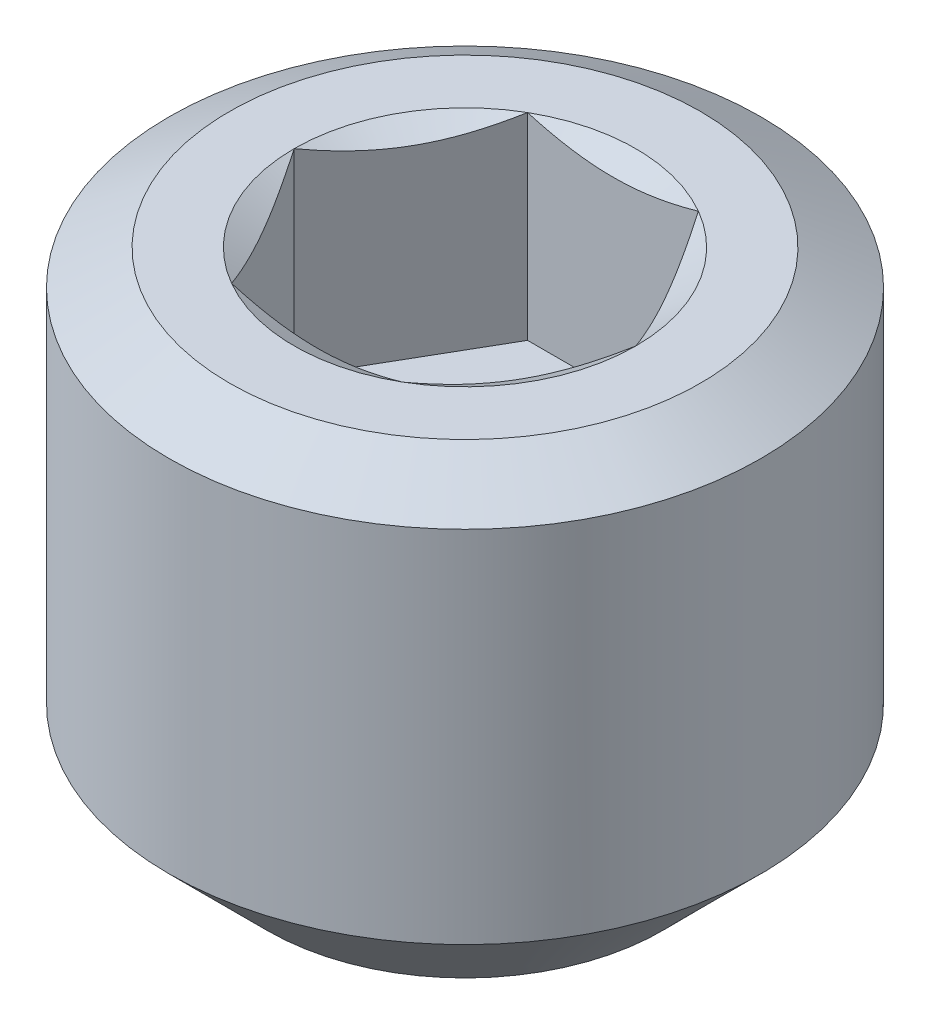
ISO-10303-21;
HEADER;
FILE_DESCRIPTION(('STEP AP214'),'2;1');
FILE_NAME('part.step','',(''),(''),'','','');
FILE_SCHEMA(('AUTOMOTIVE_DESIGN { 1 0 10303 214 1 1 1 1 }'));
ENDSEC;
DATA;
#1=APPLICATION_CONTEXT('core data for automotive mechanical design processes');
#2=APPLICATION_PROTOCOL_DEFINITION('international standard','automotive_design',2000,#1);
#3=PRODUCT_CONTEXT('',#1,'mechanical');
#4=PRODUCT('Part','Part','',(#3));
#5=PRODUCT_RELATED_PRODUCT_CATEGORY('part','',(#4));
#6=PRODUCT_DEFINITION_FORMATION('','',#4);
#7=PRODUCT_DEFINITION_CONTEXT('part definition',#1,'design');
#8=PRODUCT_DEFINITION('design','',#6,#7);
#9=PRODUCT_DEFINITION_SHAPE('','',#8);
#10=(LENGTH_UNIT() NAMED_UNIT(*) SI_UNIT(.MILLI.,.METRE.));
#11=(NAMED_UNIT(*) PLANE_ANGLE_UNIT() SI_UNIT($,.RADIAN.));
#12=(NAMED_UNIT(*) SI_UNIT($,.STERADIAN.) SOLID_ANGLE_UNIT());
#13=UNCERTAINTY_MEASURE_WITH_UNIT(LENGTH_MEASURE(1.E-05),#10,'distance_accuracy_value','');
#14=(GEOMETRIC_REPRESENTATION_CONTEXT(3) GLOBAL_UNCERTAINTY_ASSIGNED_CONTEXT((#13)) GLOBAL_UNIT_ASSIGNED_CONTEXT((#10,
#11,#12)) REPRESENTATION_CONTEXT('',''));
#15=CARTESIAN_POINT('',(0.,0.,0.));
#16=DIRECTION('',(0.,0.,1.));
#17=DIRECTION('',(1.,0.,0.));
#18=AXIS2_PLACEMENT_3D('',#15,#16,#17);
#19=CARTESIAN_POINT('',(-0.866025403784439,20.,19.7));
#20=DIRECTION('',(0.,0.,1.));
#21=DIRECTION('',(1.,0.,0.));
#22=AXIS2_PLACEMENT_3D('',#19,#20,#21);
#23=PLANE('',#22);
#24=DIRECTION('',(0.,1.,0.));
#25=VECTOR('',#24,1.);
#26=CARTESIAN_POINT('',(0.866025403784439,20.,19.7));
#27=LINE('',#26,#25);
#28=CARTESIAN_POINT('',(0.866025403787829,19.9999999999955,19.7000000000058));
#29=VERTEX_POINT('',#28);
#30=CARTESIAN_POINT('',(0.866025403784439,18.,19.7));
#31=VERTEX_POINT('',#30);
#32=EDGE_CURVE('E75',#29,#31,#27,.F.);
#33=ORIENTED_EDGE('',*,*,#32,.T.);
#34=DIRECTION('',(1.,0.,0.));
#35=VECTOR('',#34,1.);
#36=CARTESIAN_POINT('',(0.,18.,19.7));
#37=LINE('',#36,#35);
#38=CARTESIAN_POINT('',(-0.866025403784441,18.,19.7));
#39=VERTEX_POINT('',#38);
#40=EDGE_CURVE('E271',#31,#39,#37,.F.);
#41=ORIENTED_EDGE('',*,*,#40,.T.);
#42=DIRECTION('',(0.,1.,0.));
#43=VECTOR('',#42,1.);
#44=CARTESIAN_POINT('',(-0.866025403784441,20.,19.7));
#45=LINE('',#44,#43);
#46=CARTESIAN_POINT('',(-0.866025403784441,20.0000000000058,19.7));
#47=VERTEX_POINT('',#46);
#48=EDGE_CURVE('E78',#39,#47,#45,.T.);
#49=ORIENTED_EDGE('',*,*,#48,.T.);
#50=CARTESIAN_POINT('',(0.866025403788198,19.9999999999926,19.7));
#51=CARTESIAN_POINT('',(0.794933305630106,19.979475329645,19.7));
#52=CARTESIAN_POINT('',(0.723278805862876,19.9606844149257,19.7));
#53=CARTESIAN_POINT('',(0.578805828596787,19.9274738047229,19.7));
#54=CARTESIAN_POINT('',(0.50598512332056,19.9130638895754,19.7));
#55=CARTESIAN_POINT('',(0.361160826229718,19.8898910014936,19.7));
#56=CARTESIAN_POINT('',(0.289177624520724,19.8810044804205,19.7));
#57=CARTESIAN_POINT('',(0.144795924120527,19.8690748529648,19.7));
#58=CARTESIAN_POINT('',(0.0723979620602636,19.8660254037625,19.7));
#59=CARTESIAN_POINT('',(-0.0723979620604706,19.8660254037625,19.7));
#60=CARTESIAN_POINT('',(-0.144795924120941,19.8690748529648,19.7));
#61=CARTESIAN_POINT('',(-0.289177624521547,19.8810044804206,19.7));
#62=CARTESIAN_POINT('',(-0.361160826230745,19.8898910014938,19.7));
#63=CARTESIAN_POINT('',(-0.505985123321997,19.9130638895757,19.7));
#64=CARTESIAN_POINT('',(-0.57880582859843,19.9274738047232,19.7));
#65=CARTESIAN_POINT('',(-0.723278805864925,19.9606844149262,19.7));
#66=CARTESIAN_POINT('',(-0.794933305632354,19.9794753296456,19.7));
#67=CARTESIAN_POINT('',(-0.866025403790643,19.9999999999933,19.7));
#68=B_SPLINE_CURVE_WITH_KNOTS('',3,(#50,#51,#52,#53,#54,#55,#56,#57,#58,#59,#60,#61,#62,#63,#64,
#65,#66,#67),.UNSPECIFIED.,.F.,.F.,(4,2,2,2,2,2,2,2,4),(0.,0.222055046940025,0.444602239570264,
0.661973144382565,0.879107709999785,1.09624227561762,1.31361318043055,1.53616037306144,
1.75821542000211),.UNSPECIFIED.);
#69=EDGE_CURVE('E21',#29,#47,#68,.T.);
#70=ORIENTED_EDGE('',*,*,#69,.F.);
#71=EDGE_LOOP('',(#33,#41,#49,#70));
#72=FACE_BOUND('',#71,.T.);
#73=ADVANCED_FACE('F17',(#72),#23,.F.);
#74=CARTESIAN_POINT('',(0.866025403784439,20.,16.7));
#75=DIRECTION('',(0.,0.,-1.));
#76=DIRECTION('',(-1.,0.,0.));
#77=AXIS2_PLACEMENT_3D('',#74,#75,#76);
#78=PLANE('',#77);
#79=DIRECTION('',(0.,1.,0.));
#80=VECTOR('',#79,1.);
#81=CARTESIAN_POINT('',(-0.866025403784439,20.,16.7));
#82=LINE('',#81,#80);
#83=CARTESIAN_POINT('',(-0.866025403779539,19.999999999996,16.6999999999882));
#84=VERTEX_POINT('',#83);
#85=CARTESIAN_POINT('',(-0.866025403784439,18.,16.7));
#86=VERTEX_POINT('',#85);
#87=EDGE_CURVE('E235',#84,#86,#82,.F.);
#88=ORIENTED_EDGE('',*,*,#87,.T.);
#89=DIRECTION('',(1.,0.,0.));
#90=VECTOR('',#89,1.);
#91=CARTESIAN_POINT('',(0.,18.,16.7));
#92=LINE('',#91,#90);
#93=CARTESIAN_POINT('',(0.86602540378444,18.,16.7));
#94=VERTEX_POINT('',#93);
#95=EDGE_CURVE('E171',#86,#94,#92,.T.);
#96=ORIENTED_EDGE('',*,*,#95,.T.);
#97=DIRECTION('',(0.,1.,0.));
#98=VECTOR('',#97,1.);
#99=CARTESIAN_POINT('',(0.866025403784441,20.,16.7));
#100=LINE('',#99,#98);
#101=CARTESIAN_POINT('',(0.866025403787829,19.9999999999605,16.6999999999942));
#102=VERTEX_POINT('',#101);
#103=EDGE_CURVE('E90',#94,#102,#100,.T.);
#104=ORIENTED_EDGE('',*,*,#103,.T.);
#105=CARTESIAN_POINT('',(-0.866025403788196,19.9999999999926,16.7));
#106=CARTESIAN_POINT('',(-0.794933305630107,19.979475329645,16.7));
#107=CARTESIAN_POINT('',(-0.72327880586288,19.9606844149257,16.7));
#108=CARTESIAN_POINT('',(-0.578805828596799,19.9274738047229,16.7));
#109=CARTESIAN_POINT('',(-0.505985123320576,19.9130638895754,16.7));
#110=CARTESIAN_POINT('',(-0.361160826229735,19.8898910014937,16.7));
#111=CARTESIAN_POINT('',(-0.289177624520738,19.8810044804206,16.7));
#112=CARTESIAN_POINT('',(-0.144795924120535,19.8690748529648,16.7));
#113=CARTESIAN_POINT('',(-0.0723979620602673,19.8660254037625,16.7));
#114=CARTESIAN_POINT('',(0.0723979620594876,19.8660254037625,16.7));
#115=CARTESIAN_POINT('',(0.144795924118975,19.8690748529647,16.7));
#116=CARTESIAN_POINT('',(0.289177624517631,19.8810044804202,16.7));
#117=CARTESIAN_POINT('',(0.361160826225861,19.8898910014932,16.7));
#118=CARTESIAN_POINT('',(0.505985123315155,19.9130638895745,16.7));
#119=CARTESIAN_POINT('',(0.578805828590598,19.9274738047216,16.7));
#120=CARTESIAN_POINT('',(0.723278805855152,19.9606844149237,16.7));
#121=CARTESIAN_POINT('',(0.79493330562163,19.9794753296427,16.7));
#122=CARTESIAN_POINT('',(0.866025403778981,19.99999999999,16.7));
#123=B_SPLINE_CURVE_WITH_KNOTS('',3,(#105,#106,#107,#108,#109,#110,#111,#112,#113,#114,#115,
#116,#117,#118,#119,#120,#121,#122),.UNSPECIFIED.,.F.,.F.,(4,2,2,2,2,2,2,2,4),(0.,
0.222055046940014,0.444602239570241,0.661973144382551,0.879107709999782,1.09624227561468,
1.31361318042464,1.53616037305241,1.75821541998998),.UNSPECIFIED.);
#124=EDGE_CURVE('E79',#84,#102,#123,.T.);
#125=ORIENTED_EDGE('',*,*,#124,.F.);
#126=EDGE_LOOP('',(#88,#96,#104,#125));
#127=FACE_BOUND('',#126,.T.);
#128=ADVANCED_FACE('F163',(#127),#78,.F.);
#129=CARTESIAN_POINT('',(0.,18.,18.2));
#130=DIRECTION('',(0.,-1.,0.));
#131=DIRECTION('',(0.,0.,-1.));
#132=AXIS2_PLACEMENT_3D('',#129,#130,#131);
#133=PLANE('',#132);
#134=ORIENTED_EDGE('',*,*,#40,.F.);
#135=DIRECTION('',(0.5,0.,-0.866025403784439));
#136=VECTOR('',#135,1.);
#137=CARTESIAN_POINT('',(0.866025403784439,18.,19.7));
#138=LINE('',#137,#136);
#139=CARTESIAN_POINT('',(1.73205080756888,18.,18.2));
#140=VERTEX_POINT('',#139);
#141=EDGE_CURVE('E89',#31,#140,#138,.T.);
#142=ORIENTED_EDGE('',*,*,#141,.T.);
#143=DIRECTION('',(-0.5,0.,-0.866025403784439));
#144=VECTOR('',#143,1.);
#145=CARTESIAN_POINT('',(1.73205080756888,18.,18.2));
#146=LINE('',#145,#144);
#147=EDGE_CURVE('E261',#140,#94,#146,.T.);
#148=ORIENTED_EDGE('',*,*,#147,.T.);
#149=ORIENTED_EDGE('',*,*,#95,.F.);
#150=DIRECTION('',(-0.5,0.,0.866025403784439));
#151=VECTOR('',#150,1.);
#152=CARTESIAN_POINT('',(-0.866025403784439,18.,16.7));
#153=LINE('',#152,#151);
#154=CARTESIAN_POINT('',(-1.73205080756888,18.,18.2));
#155=VERTEX_POINT('',#154);
#156=EDGE_CURVE('E237',#86,#155,#153,.T.);
#157=ORIENTED_EDGE('',*,*,#156,.T.);
#158=DIRECTION('',(0.5,0.,0.866025403784439));
#159=VECTOR('',#158,1.);
#160=CARTESIAN_POINT('',(-1.73205080756888,18.,18.2));
#161=LINE('',#160,#159);
#162=EDGE_CURVE('E243',#155,#39,#161,.T.);
#163=ORIENTED_EDGE('',*,*,#162,.T.);
#164=EDGE_LOOP('',(#134,#142,#148,#149,#157,#163));
#165=FACE_BOUND('',#164,.T.);
#166=ADVANCED_FACE('F160',(#165),#133,.F.);
#167=CARTESIAN_POINT('',(1.73205080756888,20.,18.2));
#168=DIRECTION('',(0.866025403784439,0.,-0.5));
#169=DIRECTION('',(-0.5,0.,-0.866025403784439));
#170=AXIS2_PLACEMENT_3D('',#167,#168,#169);
#171=PLANE('',#170);
#172=ORIENTED_EDGE('',*,*,#103,.F.);
#173=ORIENTED_EDGE('',*,*,#147,.F.);
#174=DIRECTION('',(0.,1.,0.));
#175=VECTOR('',#174,1.);
#176=CARTESIAN_POINT('',(1.73205080756888,20.,18.2));
#177=LINE('',#176,#175);
#178=CARTESIAN_POINT('',(1.73205080757566,19.9999999999955,18.2));
#179=VERTEX_POINT('',#178);
#180=EDGE_CURVE('E253',#140,#179,#177,.T.);
#181=ORIENTED_EDGE('',*,*,#180,.T.);
#182=CARTESIAN_POINT('',(1.73205080757083,19.9999999999927,18.2000000000034));
#183=CARTESIAN_POINT('',(1.69399423591343,19.9780216588368,18.1340840843309));
#184=CARTESIAN_POINT('',(1.65560916047086,19.9580335078162,18.067599183412));
#185=CARTESIAN_POINT('',(1.57817439768088,19.9231447905399,17.9334782399877));
#186=CARTESIAN_POINT('',(1.53912333491547,19.9082565652427,17.8658398151884));
#187=CARTESIAN_POINT('',(1.46150514962965,19.8850819691978,17.7314011746821));
#188=CARTESIAN_POINT('',(1.42294996631652,19.8766413406855,17.6646216382886));
#189=CARTESIAN_POINT('',(1.34565827946197,19.8665668760853,17.5307485096538));
#190=CARTESIAN_POINT('',(1.30692205666204,19.8649246954681,17.4636554036711));
#191=CARTESIAN_POINT('',(1.23454757988258,19.8683497176036,17.3382991327178));
#192=CARTESIAN_POINT('',(1.20089846552319,19.8725759638998,17.2800171570177));
#193=CARTESIAN_POINT('',(1.13381944980834,19.8859679755265,17.1638328936778));
#194=CARTESIAN_POINT('',(1.10038978028812,19.8951383110645,17.1059310075886));
#195=CARTESIAN_POINT('',(1.03317257547485,19.9180623749922,16.9895073937092));
#196=CARTESIAN_POINT('',(0.999393543134575,19.9319132316524,16.9310003934654));
#197=CARTESIAN_POINT('',(0.93233914700621,19.9633488206188,16.8148587725002));
#198=CARTESIAN_POINT('',(0.899062924836467,19.9809261715538,16.7572226650182));
#199=CARTESIAN_POINT('',(0.86602540378717,19.99999999999,16.7000000000047));
#200=B_SPLINE_CURVE_WITH_KNOTS('',3,(#182,#183,#184,#185,#186,#187,#188,#189,#190,#191,#192,
#193,#194,#195,#196,#197,#198,#199),.UNSPECIFIED.,.F.,.F.,(4,2,2,2,2,2,2,2,4),(0.,
0.237762008669122,0.476095362773337,0.708530704618816,0.940680666678586,1.14278083697773,
1.3450681453482,1.55184121686769,1.7582084801362),.UNSPECIFIED.);
#201=EDGE_CURVE('E97',#179,#102,#200,.T.);
#202=ORIENTED_EDGE('',*,*,#201,.T.);
#203=EDGE_LOOP('',(#172,#173,#181,#202));
#204=FACE_BOUND('',#203,.T.);
#205=ADVANCED_FACE('F155',(#204),#171,.F.);
#206=CARTESIAN_POINT('',(0.866025403784439,20.,19.7));
#207=DIRECTION('',(0.866025403784439,0.,0.5));
#208=DIRECTION('',(0.5,0.,-0.866025403784439));
#209=AXIS2_PLACEMENT_3D('',#206,#207,#208);
#210=PLANE('',#209);
#211=ORIENTED_EDGE('',*,*,#180,.F.);
#212=ORIENTED_EDGE('',*,*,#141,.F.);
#213=ORIENTED_EDGE('',*,*,#32,.F.);
#214=CARTESIAN_POINT('',(0.86602540378256,19.9999999999926,19.7000000000033));
#215=CARTESIAN_POINT('',(0.904081975439967,19.9780216588368,19.6340840843307));
#216=CARTESIAN_POINT('',(0.942467050882538,19.9580335078162,19.5675991834118));
#217=CARTESIAN_POINT('',(1.01990181367252,19.9231447905399,19.4334782399876));
#218=CARTESIAN_POINT('',(1.05895287643793,19.9082565652426,19.3658398151883));
#219=CARTESIAN_POINT('',(1.13657106172375,19.8850819691977,19.231401174682));
#220=CARTESIAN_POINT('',(1.17512624503687,19.8766413406855,19.1646216382885));
#221=CARTESIAN_POINT('',(1.25241793189141,19.8665668760853,19.0307485096537));
#222=CARTESIAN_POINT('',(1.29115415469134,19.8649246954681,18.9636554036709));
#223=CARTESIAN_POINT('',(1.36352863147119,19.8683497176037,18.838299132717));
#224=CARTESIAN_POINT('',(1.39717774583097,19.8725759638999,18.7800171570162));
#225=CARTESIAN_POINT('',(1.4642567615466,19.8859679755268,18.663832893675));
#226=CARTESIAN_POINT('',(1.49768643106721,19.8951383110651,18.6059310075851));
#227=CARTESIAN_POINT('',(1.56490363588126,19.9180623749933,18.4895073937044));
#228=CARTESIAN_POINT('',(1.59868266822192,19.9319132316538,18.4310003934599));
#229=CARTESIAN_POINT('',(1.66573706435105,19.9633488206208,18.3148587724933));
#230=CARTESIAN_POINT('',(1.69901328652117,19.9809261715561,18.2572226650107));
#231=CARTESIAN_POINT('',(1.73205080757083,19.9999999999927,18.1999999999966));
#232=B_SPLINE_CURVE_WITH_KNOTS('',3,(#214,#215,#216,#217,#218,#219,#220,#221,#222,#223,#224,
#225,#226,#227,#228,#229,#230,#231),.UNSPECIFIED.,.F.,.F.,(4,2,2,2,2,2,2,2,4),(0.,
0.237762008669113,0.476095362773325,0.708530704618782,0.940680666678525,1.14278083698003,
1.34506814535286,1.55184121687484,1.7582084801458),.UNSPECIFIED.);
#233=EDGE_CURVE('E86',#29,#179,#232,.T.);
#234=ORIENTED_EDGE('',*,*,#233,.T.);
#235=EDGE_LOOP('',(#211,#212,#213,#234));
#236=FACE_BOUND('',#235,.T.);
#237=ADVANCED_FACE('F85',(#236),#210,.F.);
#238=CARTESIAN_POINT('',(-1.73205080756888,20.,18.2));
#239=DIRECTION('',(-0.866025403784439,0.,0.5));
#240=DIRECTION('',(0.5,0.,0.866025403784439));
#241=AXIS2_PLACEMENT_3D('',#238,#239,#240);
#242=PLANE('',#241);
#243=ORIENTED_EDGE('',*,*,#48,.F.);
#244=ORIENTED_EDGE('',*,*,#162,.F.);
#245=DIRECTION('',(0.,1.,0.));
#246=VECTOR('',#245,1.);
#247=CARTESIAN_POINT('',(-1.73205080756888,20.,18.2));
#248=LINE('',#247,#246);
#249=CARTESIAN_POINT('',(-1.73205080757566,19.9999999999955,18.2));
#250=VERTEX_POINT('',#249);
#251=EDGE_CURVE('E40',#155,#250,#248,.T.);
#252=ORIENTED_EDGE('',*,*,#251,.T.);
#253=CARTESIAN_POINT('',(-1.73205080757084,19.9999999999927,18.1999999999966));
#254=CARTESIAN_POINT('',(-1.69399423591343,19.9780216588368,18.2659159156691));
#255=CARTESIAN_POINT('',(-1.65560916047086,19.9580335078162,18.332400816588));
#256=CARTESIAN_POINT('',(-1.57817439768088,19.9231447905399,18.4665217600123));
#257=CARTESIAN_POINT('',(-1.53912333491546,19.9082565652427,18.5341601848116));
#258=CARTESIAN_POINT('',(-1.46150514962964,19.8850819691977,18.6685988253179));
#259=CARTESIAN_POINT('',(-1.42294996631652,19.8766413406855,18.7353783617114));
#260=CARTESIAN_POINT('',(-1.34565827946197,19.8665668760853,18.8692514903462));
#261=CARTESIAN_POINT('',(-1.30692205666205,19.8649246954681,18.936344596329));
#262=CARTESIAN_POINT('',(-1.23454757988209,19.8683497176037,19.061700867283));
#263=CARTESIAN_POINT('',(-1.20089846552221,19.8725759638999,19.119982842984));
#264=CARTESIAN_POINT('',(-1.13381944980638,19.8859679755269,19.2361671063256));
#265=CARTESIAN_POINT('',(-1.10038978028568,19.8951383110652,19.2940689924157));
#266=CARTESIAN_POINT('',(-1.03317257547143,19.9180623749935,19.4104926062967));
#267=CARTESIAN_POINT('',(-0.999393543130664,19.9319132316541,19.4689996065414));
#268=CARTESIAN_POINT('',(-0.932339147001328,19.9633488206213,19.5851412275083));
#269=CARTESIAN_POINT('',(-0.899062924831109,19.9809261715567,19.642777334991));
#270=CARTESIAN_POINT('',(-0.866025403781341,19.9999999999933,19.7000000000053));
#271=B_SPLINE_CURVE_WITH_KNOTS('',3,(#253,#254,#255,#256,#257,#258,#259,#260,#261,#262,#263,
#264,#265,#266,#267,#268,#269,#270),.UNSPECIFIED.,.F.,.F.,(4,2,2,2,2,2,2,2,4),(0.,
0.237762008669133,0.476095362773361,0.708530704618827,0.940680666678586,1.14278083698067,
1.34506814535411,1.55184121687673,1.75820848014832),.UNSPECIFIED.);
#272=EDGE_CURVE('E96',#250,#47,#271,.T.);
#273=ORIENTED_EDGE('',*,*,#272,.T.);
#274=EDGE_LOOP('',(#243,#244,#252,#273));
#275=FACE_BOUND('',#274,.T.);
#276=ADVANCED_FACE('F154',(#275),#242,.F.);
#277=CARTESIAN_POINT('',(-0.866025403784439,20.,16.7));
#278=DIRECTION('',(-0.866025403784439,0.,-0.5));
#279=DIRECTION('',(-0.5,0.,0.866025403784439));
#280=AXIS2_PLACEMENT_3D('',#277,#278,#279);
#281=PLANE('',#280);
#282=ORIENTED_EDGE('',*,*,#251,.F.);
#283=ORIENTED_EDGE('',*,*,#156,.F.);
#284=ORIENTED_EDGE('',*,*,#87,.F.);
#285=CARTESIAN_POINT('',(-0.866025403782559,19.9999999999926,16.6999999999967));
#286=CARTESIAN_POINT('',(-0.904081975439967,19.9780216588368,16.7659159156693));
#287=CARTESIAN_POINT('',(-0.942467050882539,19.9580335078162,16.8324008165882));
#288=CARTESIAN_POINT('',(-1.01990181367252,19.9231447905399,16.9665217600124));
#289=CARTESIAN_POINT('',(-1.05895287643793,19.9082565652427,17.0341601848117));
#290=CARTESIAN_POINT('',(-1.13657106172375,19.8850819691977,17.168598825318));
#291=CARTESIAN_POINT('',(-1.17512624503687,19.8766413406855,17.2353783617115));
#292=CARTESIAN_POINT('',(-1.25241793189141,19.8665668760853,17.3692514903463));
#293=CARTESIAN_POINT('',(-1.29115415469134,19.8649246954681,17.4363445963291));
#294=CARTESIAN_POINT('',(-1.36352863147119,19.8683497176037,17.561700867283));
#295=CARTESIAN_POINT('',(-1.39717774583097,19.8725759638999,17.6199828429838));
#296=CARTESIAN_POINT('',(-1.4642567615466,19.8859679755268,17.736167106325));
#297=CARTESIAN_POINT('',(-1.49768643106721,19.8951383110651,17.7940689924149));
#298=CARTESIAN_POINT('',(-1.56490363588126,19.9180623749933,17.9104926062956));
#299=CARTESIAN_POINT('',(-1.59868266822192,19.9319132316538,17.9689996065401));
#300=CARTESIAN_POINT('',(-1.66573706435105,19.9633488206208,18.0851412275067));
#301=CARTESIAN_POINT('',(-1.69901328652117,19.9809261715561,18.1427773349893));
#302=CARTESIAN_POINT('',(-1.73205080757083,19.9999999999927,18.2000000000034));
#303=B_SPLINE_CURVE_WITH_KNOTS('',3,(#285,#286,#287,#288,#289,#290,#291,#292,#293,#294,#295,
#296,#297,#298,#299,#300,#301,#302),.UNSPECIFIED.,.F.,.F.,(4,2,2,2,2,2,2,2,4),(0.,
0.237762008669116,0.476095362773325,0.708530704618782,0.940680666678525,1.14278083698002,
1.34506814535286,1.55184121687484,1.7582084801458),.UNSPECIFIED.);
#304=EDGE_CURVE('E110',#84,#250,#303,.T.);
#305=ORIENTED_EDGE('',*,*,#304,.T.);
#306=EDGE_LOOP('',(#282,#283,#284,#305));
#307=FACE_BOUND('',#306,.T.);
#308=ADVANCED_FACE('F122',(#307),#281,.F.);
#309=CARTESIAN_POINT('',(0.,19.9999999998681,18.2));
#310=DIRECTION('',(0.,1.,0.));
#311=DIRECTION('',(0.,0.,1.));
#312=AXIS2_PLACEMENT_3D('',#309,#310,#311);
#313=CONICAL_SURFACE('',#312,1.73205080735506,1.04719755115306);
#314=ORIENTED_EDGE('',*,*,#124,.T.);
#315=CARTESIAN_POINT('',(0.,19.9999999999215,18.2));
#316=DIRECTION('',(0.,1.,0.));
#317=DIRECTION('',(0.,0.,1.));
#318=AXIS2_PLACEMENT_3D('',#315,#316,#317);
#319=CIRCLE('',#318,1.73205080744765);
#320=EDGE_CURVE('E105',#84,#102,#319,.F.);
#321=ORIENTED_EDGE('',*,*,#320,.F.);
#322=EDGE_LOOP('',(#314,#321));
#323=FACE_BOUND('',#322,.T.);
#324=ADVANCED_FACE('F172',(#323),#313,.F.);
#325=CARTESIAN_POINT('',(0.,19.9999999998681,18.2));
#326=DIRECTION('',(0.,1.,0.));
#327=DIRECTION('',(0.,0.,1.));
#328=AXIS2_PLACEMENT_3D('',#325,#326,#327);
#329=CONICAL_SURFACE('',#328,1.73205080735506,1.04719755118333);
#330=CARTESIAN_POINT('',(0.,19.9999999999994,18.2));
#331=DIRECTION('',(0.,1.,0.));
#332=DIRECTION('',(0.,0.,1.));
#333=AXIS2_PLACEMENT_3D('',#330,#331,#332);
#334=CIRCLE('',#333,1.73205080758244);
#335=EDGE_CURVE('E103',#102,#179,#334,.F.);
#336=ORIENTED_EDGE('',*,*,#335,.F.);
#337=ORIENTED_EDGE('',*,*,#201,.F.);
#338=EDGE_LOOP('',(#336,#337));
#339=FACE_BOUND('',#338,.T.);
#340=ADVANCED_FACE('F141',(#339),#329,.F.);
#341=CARTESIAN_POINT('',(0.,19.9999999998681,18.2));
#342=DIRECTION('',(0.,1.,0.));
#343=DIRECTION('',(0.,0.,1.));
#344=AXIS2_PLACEMENT_3D('',#341,#342,#343);
#345=CONICAL_SURFACE('',#344,1.73205080735506,1.04719755118333);
#346=CARTESIAN_POINT('',(0.,19.9999999999994,18.2));
#347=DIRECTION('',(0.,1.,0.));
#348=DIRECTION('',(0.,0.,1.));
#349=AXIS2_PLACEMENT_3D('',#346,#347,#348);
#350=CIRCLE('',#349,1.73205080758244);
#351=EDGE_CURVE('E68',#179,#29,#350,.F.);
#352=ORIENTED_EDGE('',*,*,#351,.F.);
#353=ORIENTED_EDGE('',*,*,#233,.F.);
#354=EDGE_LOOP('',(#352,#353));
#355=FACE_BOUND('',#354,.T.);
#356=ADVANCED_FACE('F94',(#355),#345,.F.);
#357=CARTESIAN_POINT('',(0.,19.9999999998681,18.2));
#358=DIRECTION('',(0.,1.,0.));
#359=DIRECTION('',(0.,0.,1.));
#360=AXIS2_PLACEMENT_3D('',#357,#358,#359);
#361=CONICAL_SURFACE('',#360,1.73205080735506,1.04719755115306);
#362=ORIENTED_EDGE('',*,*,#69,.T.);
#363=CARTESIAN_POINT('',(0.,20.0000000000201,18.2));
#364=DIRECTION('',(0.,1.,0.));
#365=DIRECTION('',(0.,0.,1.));
#366=AXIS2_PLACEMENT_3D('',#363,#364,#365);
#367=CIRCLE('',#366,1.73205080761818);
#368=EDGE_CURVE('E60',#29,#47,#367,.F.);
#369=ORIENTED_EDGE('',*,*,#368,.F.);
#370=EDGE_LOOP('',(#362,#369));
#371=FACE_BOUND('',#370,.T.);
#372=ADVANCED_FACE('F62',(#371),#361,.F.);
#373=CARTESIAN_POINT('',(0.,19.9999999998681,18.2));
#374=DIRECTION('',(0.,1.,0.));
#375=DIRECTION('',(0.,0.,1.));
#376=AXIS2_PLACEMENT_3D('',#373,#374,#375);
#377=CONICAL_SURFACE('',#376,1.73205080735506,1.04719755118333);
#378=CARTESIAN_POINT('',(0.,19.9999999999994,18.2));
#379=DIRECTION('',(0.,1.,0.));
#380=DIRECTION('',(0.,0.,1.));
#381=AXIS2_PLACEMENT_3D('',#378,#379,#380);
#382=CIRCLE('',#381,1.73205080758244);
#383=EDGE_CURVE('E67',#47,#250,#382,.F.);
#384=ORIENTED_EDGE('',*,*,#383,.F.);
#385=ORIENTED_EDGE('',*,*,#272,.F.);
#386=EDGE_LOOP('',(#384,#385));
#387=FACE_BOUND('',#386,.T.);
#388=ADVANCED_FACE('F129',(#387),#377,.F.);
#389=CARTESIAN_POINT('',(0.,19.9999999998681,18.2));
#390=DIRECTION('',(0.,1.,0.));
#391=DIRECTION('',(0.,0.,1.));
#392=AXIS2_PLACEMENT_3D('',#389,#390,#391);
#393=CONICAL_SURFACE('',#392,1.73205080735506,1.04719755118333);
#394=CARTESIAN_POINT('',(0.,19.9999999999994,18.2));
#395=DIRECTION('',(0.,1.,0.));
#396=DIRECTION('',(0.,0.,1.));
#397=AXIS2_PLACEMENT_3D('',#394,#395,#396);
#398=CIRCLE('',#397,1.73205080758244);
#399=EDGE_CURVE('E221',#250,#84,#398,.F.);
#400=ORIENTED_EDGE('',*,*,#399,.F.);
#401=ORIENTED_EDGE('',*,*,#304,.F.);
#402=EDGE_LOOP('',(#400,#401));
#403=FACE_BOUND('',#402,.T.);
#404=ADVANCED_FACE('F125',(#403),#393,.F.);
#405=CARTESIAN_POINT('',(0.,20.,16.1407245962156));
#406=DIRECTION('',(0.,1.,0.));
#407=DIRECTION('',(0.,0.,1.));
#408=AXIS2_PLACEMENT_3D('',#405,#406,#407);
#409=PLANE('',#408);
#410=ORIENTED_EDGE('',*,*,#383,.T.);
#411=ORIENTED_EDGE('',*,*,#399,.T.);
#412=ORIENTED_EDGE('',*,*,#320,.T.);
#413=ORIENTED_EDGE('',*,*,#335,.T.);
#414=ORIENTED_EDGE('',*,*,#351,.T.);
#415=ORIENTED_EDGE('',*,*,#368,.T.);
#416=EDGE_LOOP('',(#410,#411,#412,#413,#414,#415));
#417=FACE_BOUND('',#416,.T.);
#418=CARTESIAN_POINT('',(0.,20.0000000000573,18.2));
#419=DIRECTION('',(0.,-1.,0.));
#420=DIRECTION('',(0.,0.,-1.));
#421=AXIS2_PLACEMENT_3D('',#418,#419,#420);
#422=CIRCLE('',#421,2.38649999994323);
#423=CARTESIAN_POINT('',(0.,20.0000000000573,15.8135000000568));
#424=VERTEX_POINT('',#423);
#425=EDGE_CURVE('E212',#424,#424,#422,.T.);
#426=ORIENTED_EDGE('',*,*,#425,.F.);
#427=EDGE_LOOP('',(#426));
#428=FACE_BOUND('',#427,.T.);
#429=ADVANCED_FACE('F99',(#417,#428),#409,.T.);
#430=CARTESIAN_POINT('',(0.,15.,17.2));
#431=DIRECTION('',(0.,-1.,0.));
#432=DIRECTION('',(0.,0.,-1.));
#433=AXIS2_PLACEMENT_3D('',#430,#431,#432);
#434=PLANE('',#433);
#435=CARTESIAN_POINT('',(0.,15.0000000001358,18.2));
#436=DIRECTION('',(0.,1.,0.));
#437=DIRECTION('',(0.,0.,1.));
#438=AXIS2_PLACEMENT_3D('',#435,#436,#437);
#439=CIRCLE('',#438,2.00000000018008);
#440=CARTESIAN_POINT('',(0.,15.0000000001358,20.2000000001801));
#441=VERTEX_POINT('',#440);
#442=EDGE_CURVE('E210',#441,#441,#439,.T.);
#443=ORIENTED_EDGE('',*,*,#442,.F.);
#444=EDGE_LOOP('',(#443));
#445=FACE_BOUND('',#444,.T.);
#446=ADVANCED_FACE('F200',(#445),#434,.T.);
#447=CARTESIAN_POINT('',(0.,19.6457956100175,18.2));
#448=DIRECTION('',(0.,-1.,0.));
#449=DIRECTION('',(0.,0.,-1.));
#450=AXIS2_PLACEMENT_3D('',#447,#448,#449);
#451=CONICAL_SURFACE('',#450,2.99999999972279,1.04719755117319);
#452=ORIENTED_EDGE('',*,*,#425,.T.);
#453=EDGE_LOOP('',(#452));
#454=FACE_BOUND('',#453,.T.);
#455=CARTESIAN_POINT('',(0.,19.6457956098522,18.2));
#456=DIRECTION('',(0.,1.,0.));
#457=DIRECTION('',(0.,0.,1.));
#458=AXIS2_PLACEMENT_3D('',#455,#456,#457);
#459=CIRCLE('',#458,3.);
#460=CARTESIAN_POINT('',(0.,19.6457956098522,21.2));
#461=VERTEX_POINT('',#460);
#462=EDGE_CURVE('E32',#461,#461,#459,.F.);
#463=ORIENTED_EDGE('',*,*,#462,.F.);
#464=EDGE_LOOP('',(#463));
#465=FACE_BOUND('',#464,.T.);
#466=ADVANCED_FACE('F193',(#454,#465),#451,.T.);
#467=CARTESIAN_POINT('',(0.,16.0000000000764,18.2));
#468=DIRECTION('',(0.,1.,0.));
#469=DIRECTION('',(0.,0.,1.));
#470=AXIS2_PLACEMENT_3D('',#467,#468,#469);
#471=CONICAL_SURFACE('',#470,3.00000000017754,0.785398163425871);
#472=ORIENTED_EDGE('',*,*,#442,.T.);
#473=EDGE_LOOP('',(#472));
#474=FACE_BOUND('',#473,.T.);
#475=CARTESIAN_POINT('',(0.,16.,18.2));
#476=DIRECTION('',(0.,1.,0.));
#477=DIRECTION('',(0.,0.,1.));
#478=AXIS2_PLACEMENT_3D('',#475,#476,#477);
#479=CIRCLE('',#478,3.);
#480=CARTESIAN_POINT('',(0.,16.,21.2));
#481=VERTEX_POINT('',#480);
#482=EDGE_CURVE('E11',#481,#481,#479,.T.);
#483=ORIENTED_EDGE('',*,*,#482,.F.);
#484=EDGE_LOOP('',(#483));
#485=FACE_BOUND('',#484,.T.);
#486=ADVANCED_FACE('F186',(#474,#485),#471,.T.);
#487=CARTESIAN_POINT('',(0.,17.8228978049261,18.2));
#488=DIRECTION('',(0.,1.,0.));
#489=DIRECTION('',(0.,0.,1.));
#490=AXIS2_PLACEMENT_3D('',#487,#488,#489);
#491=CYLINDRICAL_SURFACE('',#490,3.);
#492=ORIENTED_EDGE('',*,*,#462,.T.);
#493=EDGE_LOOP('',(#492));
#494=FACE_BOUND('',#493,.T.);
#495=ORIENTED_EDGE('',*,*,#482,.T.);
#496=EDGE_LOOP('',(#495));
#497=FACE_BOUND('',#496,.T.);
#498=ADVANCED_FACE('F184',(#494,#497),#491,.T.);
#499=CLOSED_SHELL('',(#73,#128,#166,#205,#237,#276,#308,#324,#340,#356,#372,#388,#404,#429,#446,
#466,#486,#498));
#500=MANIFOLD_SOLID_BREP('B1',#499);
#501=ADVANCED_BREP_SHAPE_REPRESENTATION('',(#18,#500),#14);
#502=SHAPE_DEFINITION_REPRESENTATION(#9,#501);
ENDSEC;
END-ISO-10303-21;
